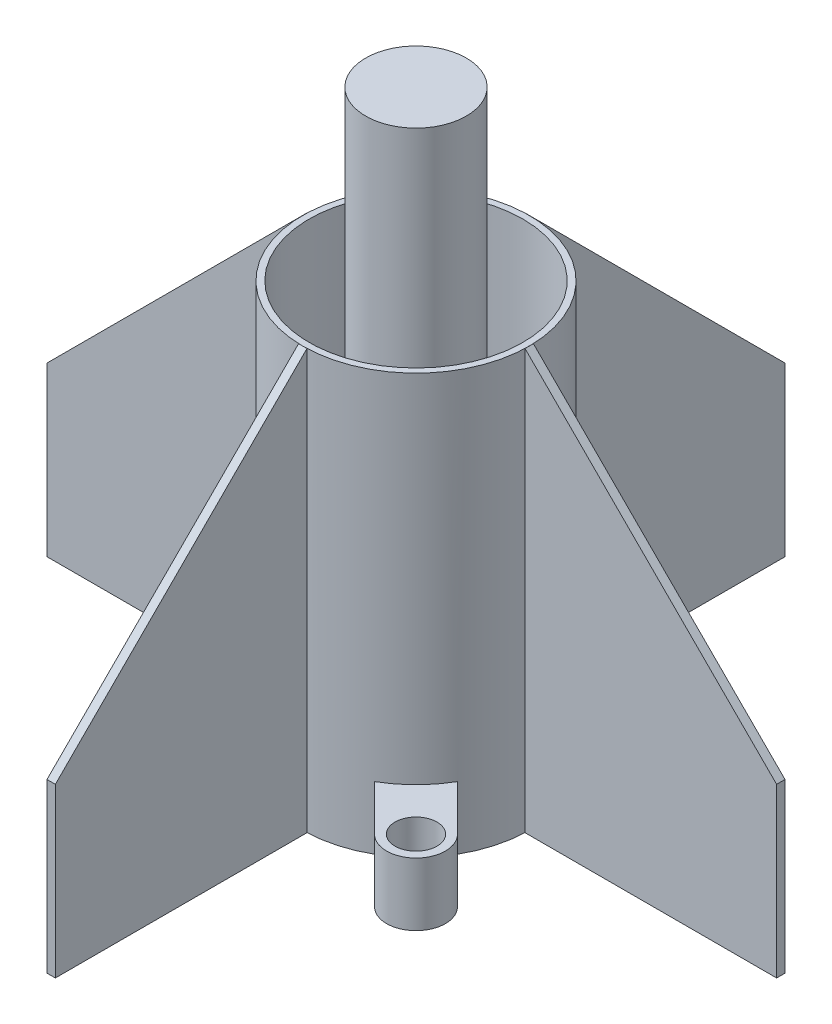
ISO-10303-21;
HEADER;
FILE_DESCRIPTION(('STEP AP214'),'2;1');
FILE_NAME('part.step','',(''),(''),'','','');
FILE_SCHEMA(('AUTOMOTIVE_DESIGN { 1 0 10303 214 1 1 1 1 }'));
ENDSEC;
DATA;
#1=APPLICATION_CONTEXT('core data for automotive mechanical design processes');
#2=APPLICATION_PROTOCOL_DEFINITION('international standard','automotive_design',2000,#1);
#3=PRODUCT_CONTEXT('',#1,'mechanical');
#4=PRODUCT('Part','Part','',(#3));
#5=PRODUCT_RELATED_PRODUCT_CATEGORY('part','',(#4));
#6=PRODUCT_DEFINITION_FORMATION('','',#4);
#7=PRODUCT_DEFINITION_CONTEXT('part definition',#1,'design');
#8=PRODUCT_DEFINITION('design','',#6,#7);
#9=PRODUCT_DEFINITION_SHAPE('','',#8);
#10=(LENGTH_UNIT() NAMED_UNIT(*) SI_UNIT(.MILLI.,.METRE.));
#11=(NAMED_UNIT(*) PLANE_ANGLE_UNIT() SI_UNIT($,.RADIAN.));
#12=(NAMED_UNIT(*) SI_UNIT($,.STERADIAN.) SOLID_ANGLE_UNIT());
#13=UNCERTAINTY_MEASURE_WITH_UNIT(LENGTH_MEASURE(1.E-05),#10,'distance_accuracy_value','');
#14=(GEOMETRIC_REPRESENTATION_CONTEXT(3) GLOBAL_UNCERTAINTY_ASSIGNED_CONTEXT((#13)) GLOBAL_UNIT_ASSIGNED_CONTEXT((#10,
#11,#12)) REPRESENTATION_CONTEXT('',''));
#15=CARTESIAN_POINT('',(0.,0.,0.));
#16=DIRECTION('',(0.,0.,1.));
#17=DIRECTION('',(1.,0.,0.));
#18=AXIS2_PLACEMENT_3D('',#15,#16,#17);
#19=CARTESIAN_POINT('',(1.,0.,-87.));
#20=DIRECTION('',(0.,1.,0.));
#21=DIRECTION('',(0.,0.,1.));
#22=AXIS2_PLACEMENT_3D('',#19,#20,#21);
#23=PLANE('',#22);
#24=DIRECTION('',(0.,0.,-1.));
#25=VECTOR('',#24,1.);
#26=CARTESIAN_POINT('',(-1.,0.,-87.));
#27=LINE('',#26,#25);
#28=CARTESIAN_POINT('',(-1.,0.,-27.));
#29=VERTEX_POINT('',#28);
#30=CARTESIAN_POINT('',(-1.,0.,-87.));
#31=VERTEX_POINT('',#30);
#32=EDGE_CURVE('E108',#29,#31,#27,.T.);
#33=ORIENTED_EDGE('',*,*,#32,.T.);
#34=DIRECTION('',(-1.,0.,0.));
#35=VECTOR('',#34,1.);
#36=CARTESIAN_POINT('',(1.,0.,-87.));
#37=LINE('',#36,#35);
#38=CARTESIAN_POINT('',(1.,0.,-87.));
#39=VERTEX_POINT('',#38);
#40=EDGE_CURVE('E12',#39,#31,#37,.T.);
#41=ORIENTED_EDGE('',*,*,#40,.F.);
#42=DIRECTION('',(0.,0.,-1.));
#43=VECTOR('',#42,1.);
#44=CARTESIAN_POINT('',(1.,0.,-87.));
#45=LINE('',#44,#43);
#46=CARTESIAN_POINT('',(1.,0.,-27.));
#47=VERTEX_POINT('',#46);
#48=EDGE_CURVE('E96',#47,#39,#45,.T.);
#49=ORIENTED_EDGE('',*,*,#48,.F.);
#50=DIRECTION('',(-1.,0.,0.));
#51=VECTOR('',#50,1.);
#52=CARTESIAN_POINT('',(1.,0.,-27.));
#53=LINE('',#52,#51);
#54=EDGE_CURVE('E104',#47,#29,#53,.T.);
#55=ORIENTED_EDGE('',*,*,#54,.T.);
#56=EDGE_LOOP('',(#33,#41,#49,#55));
#57=FACE_BOUND('',#56,.T.);
#58=ADVANCED_FACE('F45',(#57),#23,.F.);
#59=CARTESIAN_POINT('',(1.,40.,-87.));
#60=DIRECTION('',(0.,0.,1.));
#61=DIRECTION('',(1.,0.,0.));
#62=AXIS2_PLACEMENT_3D('',#59,#60,#61);
#63=PLANE('',#62);
#64=DIRECTION('',(0.,1.,0.));
#65=VECTOR('',#64,1.);
#66=CARTESIAN_POINT('',(-1.,40.,-87.));
#67=LINE('',#66,#65);
#68=CARTESIAN_POINT('',(-1.,40.,-87.));
#69=VERTEX_POINT('',#68);
#70=EDGE_CURVE('E100',#31,#69,#67,.T.);
#71=ORIENTED_EDGE('',*,*,#70,.T.);
#72=DIRECTION('',(-1.,0.,0.));
#73=VECTOR('',#72,1.);
#74=CARTESIAN_POINT('',(1.,40.,-87.));
#75=LINE('',#74,#73);
#76=CARTESIAN_POINT('',(1.,40.,-87.));
#77=VERTEX_POINT('',#76);
#78=EDGE_CURVE('E53',#77,#69,#75,.T.);
#79=ORIENTED_EDGE('',*,*,#78,.F.);
#80=DIRECTION('',(0.,1.,0.));
#81=VECTOR('',#80,1.);
#82=CARTESIAN_POINT('',(1.,40.,-87.));
#83=LINE('',#82,#81);
#84=EDGE_CURVE('E91',#39,#77,#83,.T.);
#85=ORIENTED_EDGE('',*,*,#84,.F.);
#86=ORIENTED_EDGE('',*,*,#40,.T.);
#87=EDGE_LOOP('',(#71,#79,#85,#86));
#88=FACE_BOUND('',#87,.T.);
#89=ADVANCED_FACE('F99',(#88),#63,.F.);
#90=CARTESIAN_POINT('',(1.,100.,-27.));
#91=DIRECTION('',(0.,-0.707106781186547,0.707106781186547));
#92=DIRECTION('',(0.,-0.707106781186548,-0.707106781186548));
#93=AXIS2_PLACEMENT_3D('',#90,#91,#92);
#94=PLANE('',#93);
#95=DIRECTION('',(0.,0.707106781186547,0.707106781186547));
#96=VECTOR('',#95,1.);
#97=CARTESIAN_POINT('',(-1.,100.,-27.));
#98=LINE('',#97,#96);
#99=CARTESIAN_POINT('',(-1.,100.,-27.));
#100=VERTEX_POINT('',#99);
#101=EDGE_CURVE('E78',#69,#100,#98,.T.);
#102=ORIENTED_EDGE('',*,*,#101,.T.);
#103=DIRECTION('',(-1.,0.,0.));
#104=VECTOR('',#103,1.);
#105=CARTESIAN_POINT('',(1.,100.,-27.));
#106=LINE('',#105,#104);
#107=CARTESIAN_POINT('',(1.,100.,-27.));
#108=VERTEX_POINT('',#107);
#109=EDGE_CURVE('E101',#108,#100,#106,.T.);
#110=ORIENTED_EDGE('',*,*,#109,.F.);
#111=DIRECTION('',(0.,0.707106781186547,0.707106781186547));
#112=VECTOR('',#111,1.);
#113=CARTESIAN_POINT('',(1.,100.,-27.));
#114=LINE('',#113,#112);
#115=EDGE_CURVE('E94',#77,#108,#114,.T.);
#116=ORIENTED_EDGE('',*,*,#115,.F.);
#117=ORIENTED_EDGE('',*,*,#78,.T.);
#118=EDGE_LOOP('',(#102,#110,#116,#117));
#119=FACE_BOUND('',#118,.T.);
#120=ADVANCED_FACE('F102',(#119),#94,.F.);
#121=CARTESIAN_POINT('',(1.,0.,-27.));
#122=DIRECTION('',(0.,0.,-1.));
#123=DIRECTION('',(-1.,0.,0.));
#124=AXIS2_PLACEMENT_3D('',#121,#122,#123);
#125=PLANE('',#124);
#126=DIRECTION('',(0.,-1.,0.));
#127=VECTOR('',#126,1.);
#128=CARTESIAN_POINT('',(-1.,0.,-27.));
#129=LINE('',#128,#127);
#130=EDGE_CURVE('E84',#100,#29,#129,.T.);
#131=ORIENTED_EDGE('',*,*,#130,.T.);
#132=ORIENTED_EDGE('',*,*,#54,.F.);
#133=DIRECTION('',(0.,-1.,0.));
#134=VECTOR('',#133,1.);
#135=CARTESIAN_POINT('',(1.,0.,-27.));
#136=LINE('',#135,#134);
#137=EDGE_CURVE('E61',#108,#47,#136,.T.);
#138=ORIENTED_EDGE('',*,*,#137,.F.);
#139=ORIENTED_EDGE('',*,*,#109,.T.);
#140=EDGE_LOOP('',(#131,#132,#138,#139));
#141=FACE_BOUND('',#140,.T.);
#142=ADVANCED_FACE('F115',(#141),#125,.F.);
#143=CARTESIAN_POINT('',(1.,0.,0.));
#144=DIRECTION('',(-1.,0.,0.));
#145=DIRECTION('',(0.,0.,1.));
#146=AXIS2_PLACEMENT_3D('',#143,#144,#145);
#147=PLANE('',#146);
#148=ORIENTED_EDGE('',*,*,#48,.T.);
#149=ORIENTED_EDGE('',*,*,#84,.T.);
#150=ORIENTED_EDGE('',*,*,#115,.T.);
#151=ORIENTED_EDGE('',*,*,#137,.T.);
#152=EDGE_LOOP('',(#148,#149,#150,#151));
#153=FACE_BOUND('',#152,.T.);
#154=ADVANCED_FACE('F92',(#153),#147,.F.);
#155=CARTESIAN_POINT('',(-1.,0.,0.));
#156=DIRECTION('',(-1.,0.,0.));
#157=DIRECTION('',(0.,0.,1.));
#158=AXIS2_PLACEMENT_3D('',#155,#156,#157);
#159=PLANE('',#158);
#160=ORIENTED_EDGE('',*,*,#32,.F.);
#161=ORIENTED_EDGE('',*,*,#130,.F.);
#162=ORIENTED_EDGE('',*,*,#101,.F.);
#163=ORIENTED_EDGE('',*,*,#70,.F.);
#164=EDGE_LOOP('',(#160,#161,#162,#163));
#165=FACE_BOUND('',#164,.T.);
#166=ADVANCED_FACE('F118',(#165),#159,.T.);
#167=CLOSED_SHELL('',(#58,#89,#120,#142,#154,#166));
#168=MANIFOLD_SOLID_BREP('B2',#167);
#169=CARTESIAN_POINT('',(1.,0.,27.));
#170=DIRECTION('',(0.,0.,1.));
#171=DIRECTION('',(1.,0.,0.));
#172=AXIS2_PLACEMENT_3D('',#169,#170,#171);
#173=PLANE('',#172);
#174=DIRECTION('',(0.,1.,0.));
#175=VECTOR('',#174,1.);
#176=CARTESIAN_POINT('',(-1.,0.,27.));
#177=LINE('',#176,#175);
#178=CARTESIAN_POINT('',(-1.,0.,27.));
#179=VERTEX_POINT('',#178);
#180=CARTESIAN_POINT('',(-1.,100.,27.));
#181=VERTEX_POINT('',#180);
#182=EDGE_CURVE('E241',#179,#181,#177,.T.);
#183=ORIENTED_EDGE('',*,*,#182,.T.);
#184=DIRECTION('',(-1.,0.,0.));
#185=VECTOR('',#184,1.);
#186=CARTESIAN_POINT('',(1.,100.,27.));
#187=LINE('',#186,#185);
#188=CARTESIAN_POINT('',(1.,100.,27.));
#189=VERTEX_POINT('',#188);
#190=EDGE_CURVE('E43',#189,#181,#187,.T.);
#191=ORIENTED_EDGE('',*,*,#190,.F.);
#192=DIRECTION('',(0.,1.,0.));
#193=VECTOR('',#192,1.);
#194=CARTESIAN_POINT('',(1.,0.,27.));
#195=LINE('',#194,#193);
#196=CARTESIAN_POINT('',(1.,0.,27.));
#197=VERTEX_POINT('',#196);
#198=EDGE_CURVE('E229',#197,#189,#195,.T.);
#199=ORIENTED_EDGE('',*,*,#198,.F.);
#200=DIRECTION('',(-1.,0.,0.));
#201=VECTOR('',#200,1.);
#202=CARTESIAN_POINT('',(1.,0.,27.));
#203=LINE('',#202,#201);
#204=EDGE_CURVE('E237',#197,#179,#203,.T.);
#205=ORIENTED_EDGE('',*,*,#204,.T.);
#206=EDGE_LOOP('',(#183,#191,#199,#205));
#207=FACE_BOUND('',#206,.T.);
#208=ADVANCED_FACE('F178',(#207),#173,.F.);
#209=CARTESIAN_POINT('',(1.,100.,27.));
#210=DIRECTION('',(0.,-0.707106781186547,-0.707106781186547));
#211=DIRECTION('',(0.,0.707106781186548,-0.707106781186548));
#212=AXIS2_PLACEMENT_3D('',#209,#210,#211);
#213=PLANE('',#212);
#214=DIRECTION('',(0.,-0.707106781186547,0.707106781186547));
#215=VECTOR('',#214,1.);
#216=CARTESIAN_POINT('',(-1.,100.,27.));
#217=LINE('',#216,#215);
#218=CARTESIAN_POINT('',(-1.,40.,87.));
#219=VERTEX_POINT('',#218);
#220=EDGE_CURVE('E233',#181,#219,#217,.T.);
#221=ORIENTED_EDGE('',*,*,#220,.T.);
#222=DIRECTION('',(-1.,0.,0.));
#223=VECTOR('',#222,1.);
#224=CARTESIAN_POINT('',(1.,40.,87.));
#225=LINE('',#224,#223);
#226=CARTESIAN_POINT('',(1.,40.,87.));
#227=VERTEX_POINT('',#226);
#228=EDGE_CURVE('E186',#227,#219,#225,.T.);
#229=ORIENTED_EDGE('',*,*,#228,.F.);
#230=DIRECTION('',(0.,-0.707106781186547,0.707106781186547));
#231=VECTOR('',#230,1.);
#232=CARTESIAN_POINT('',(1.,100.,27.));
#233=LINE('',#232,#231);
#234=EDGE_CURVE('E224',#189,#227,#233,.T.);
#235=ORIENTED_EDGE('',*,*,#234,.F.);
#236=ORIENTED_EDGE('',*,*,#190,.T.);
#237=EDGE_LOOP('',(#221,#229,#235,#236));
#238=FACE_BOUND('',#237,.T.);
#239=ADVANCED_FACE('F232',(#238),#213,.F.);
#240=CARTESIAN_POINT('',(1.,40.,87.));
#241=DIRECTION('',(0.,0.,-1.));
#242=DIRECTION('',(-1.,0.,0.));
#243=AXIS2_PLACEMENT_3D('',#240,#241,#242);
#244=PLANE('',#243);
#245=DIRECTION('',(0.,-1.,0.));
#246=VECTOR('',#245,1.);
#247=CARTESIAN_POINT('',(-1.,40.,87.));
#248=LINE('',#247,#246);
#249=CARTESIAN_POINT('',(-1.,0.,87.));
#250=VERTEX_POINT('',#249);
#251=EDGE_CURVE('E211',#219,#250,#248,.T.);
#252=ORIENTED_EDGE('',*,*,#251,.T.);
#253=DIRECTION('',(-1.,0.,0.));
#254=VECTOR('',#253,1.);
#255=CARTESIAN_POINT('',(1.,0.,87.));
#256=LINE('',#255,#254);
#257=CARTESIAN_POINT('',(1.,0.,87.));
#258=VERTEX_POINT('',#257);
#259=EDGE_CURVE('E234',#258,#250,#256,.T.);
#260=ORIENTED_EDGE('',*,*,#259,.F.);
#261=DIRECTION('',(0.,-1.,0.));
#262=VECTOR('',#261,1.);
#263=CARTESIAN_POINT('',(1.,40.,87.));
#264=LINE('',#263,#262);
#265=EDGE_CURVE('E227',#227,#258,#264,.T.);
#266=ORIENTED_EDGE('',*,*,#265,.F.);
#267=ORIENTED_EDGE('',*,*,#228,.T.);
#268=EDGE_LOOP('',(#252,#260,#266,#267));
#269=FACE_BOUND('',#268,.T.);
#270=ADVANCED_FACE('F235',(#269),#244,.F.);
#271=CARTESIAN_POINT('',(1.,0.,87.));
#272=DIRECTION('',(0.,1.,0.));
#273=DIRECTION('',(0.,0.,1.));
#274=AXIS2_PLACEMENT_3D('',#271,#272,#273);
#275=PLANE('',#274);
#276=DIRECTION('',(0.,0.,-1.));
#277=VECTOR('',#276,1.);
#278=CARTESIAN_POINT('',(-1.,0.,87.));
#279=LINE('',#278,#277);
#280=EDGE_CURVE('E217',#250,#179,#279,.T.);
#281=ORIENTED_EDGE('',*,*,#280,.T.);
#282=ORIENTED_EDGE('',*,*,#204,.F.);
#283=DIRECTION('',(0.,0.,-1.));
#284=VECTOR('',#283,1.);
#285=CARTESIAN_POINT('',(1.,0.,87.));
#286=LINE('',#285,#284);
#287=EDGE_CURVE('E194',#258,#197,#286,.T.);
#288=ORIENTED_EDGE('',*,*,#287,.F.);
#289=ORIENTED_EDGE('',*,*,#259,.T.);
#290=EDGE_LOOP('',(#281,#282,#288,#289));
#291=FACE_BOUND('',#290,.T.);
#292=ADVANCED_FACE('F248',(#291),#275,.F.);
#293=CARTESIAN_POINT('',(1.,0.,0.));
#294=DIRECTION('',(-1.,0.,0.));
#295=DIRECTION('',(0.,0.,1.));
#296=AXIS2_PLACEMENT_3D('',#293,#294,#295);
#297=PLANE('',#296);
#298=ORIENTED_EDGE('',*,*,#198,.T.);
#299=ORIENTED_EDGE('',*,*,#234,.T.);
#300=ORIENTED_EDGE('',*,*,#265,.T.);
#301=ORIENTED_EDGE('',*,*,#287,.T.);
#302=EDGE_LOOP('',(#298,#299,#300,#301));
#303=FACE_BOUND('',#302,.T.);
#304=ADVANCED_FACE('F225',(#303),#297,.F.);
#305=CARTESIAN_POINT('',(-1.,0.,0.));
#306=DIRECTION('',(-1.,0.,0.));
#307=DIRECTION('',(0.,0.,1.));
#308=AXIS2_PLACEMENT_3D('',#305,#306,#307);
#309=PLANE('',#308);
#310=ORIENTED_EDGE('',*,*,#182,.F.);
#311=ORIENTED_EDGE('',*,*,#280,.F.);
#312=ORIENTED_EDGE('',*,*,#251,.F.);
#313=ORIENTED_EDGE('',*,*,#220,.F.);
#314=EDGE_LOOP('',(#310,#311,#312,#313));
#315=FACE_BOUND('',#314,.T.);
#316=ADVANCED_FACE('F251',(#315),#309,.T.);
#317=CLOSED_SHELL('',(#208,#239,#270,#292,#304,#316));
#318=MANIFOLD_SOLID_BREP('B6',#317);
#319=CARTESIAN_POINT('',(-87.,40.,1.));
#320=DIRECTION('',(1.,0.,0.));
#321=DIRECTION('',(0.,0.,-1.));
#322=AXIS2_PLACEMENT_3D('',#319,#320,#321);
#323=PLANE('',#322);
#324=DIRECTION('',(0.,-1.,0.));
#325=VECTOR('',#324,1.);
#326=CARTESIAN_POINT('',(-87.,40.,-1.));
#327=LINE('',#326,#325);
#328=CARTESIAN_POINT('',(-87.,40.,-1.));
#329=VERTEX_POINT('',#328);
#330=CARTESIAN_POINT('',(-87.,0.,-1.));
#331=VERTEX_POINT('',#330);
#332=EDGE_CURVE('E374',#329,#331,#327,.T.);
#333=ORIENTED_EDGE('',*,*,#332,.T.);
#334=DIRECTION('',(0.,0.,-1.));
#335=VECTOR('',#334,1.);
#336=CARTESIAN_POINT('',(-87.,0.,1.));
#337=LINE('',#336,#335);
#338=CARTESIAN_POINT('',(-87.,0.,1.));
#339=VERTEX_POINT('',#338);
#340=EDGE_CURVE('E176',#339,#331,#337,.T.);
#341=ORIENTED_EDGE('',*,*,#340,.F.);
#342=DIRECTION('',(0.,-1.,0.));
#343=VECTOR('',#342,1.);
#344=CARTESIAN_POINT('',(-87.,40.,1.));
#345=LINE('',#344,#343);
#346=CARTESIAN_POINT('',(-87.,40.,1.));
#347=VERTEX_POINT('',#346);
#348=EDGE_CURVE('E362',#347,#339,#345,.T.);
#349=ORIENTED_EDGE('',*,*,#348,.F.);
#350=DIRECTION('',(0.,0.,-1.));
#351=VECTOR('',#350,1.);
#352=CARTESIAN_POINT('',(-87.,40.,1.));
#353=LINE('',#352,#351);
#354=EDGE_CURVE('E370',#347,#329,#353,.T.);
#355=ORIENTED_EDGE('',*,*,#354,.T.);
#356=EDGE_LOOP('',(#333,#341,#349,#355));
#357=FACE_BOUND('',#356,.T.);
#358=ADVANCED_FACE('F311',(#357),#323,.F.);
#359=CARTESIAN_POINT('',(-87.,0.,1.));
#360=DIRECTION('',(0.,1.,0.));
#361=DIRECTION('',(-1.,0.,0.));
#362=AXIS2_PLACEMENT_3D('',#359,#360,#361);
#363=PLANE('',#362);
#364=DIRECTION('',(1.,0.,0.));
#365=VECTOR('',#364,1.);
#366=CARTESIAN_POINT('',(-87.,0.,-1.));
#367=LINE('',#366,#365);
#368=CARTESIAN_POINT('',(-27.,0.,-1.));
#369=VERTEX_POINT('',#368);
#370=EDGE_CURVE('E366',#331,#369,#367,.T.);
#371=ORIENTED_EDGE('',*,*,#370,.T.);
#372=DIRECTION('',(0.,0.,-1.));
#373=VECTOR('',#372,1.);
#374=CARTESIAN_POINT('',(-27.,0.,1.));
#375=LINE('',#374,#373);
#376=CARTESIAN_POINT('',(-27.,0.,1.));
#377=VERTEX_POINT('',#376);
#378=EDGE_CURVE('E319',#377,#369,#375,.T.);
#379=ORIENTED_EDGE('',*,*,#378,.F.);
#380=DIRECTION('',(1.,0.,0.));
#381=VECTOR('',#380,1.);
#382=CARTESIAN_POINT('',(-87.,0.,1.));
#383=LINE('',#382,#381);
#384=EDGE_CURVE('E357',#339,#377,#383,.T.);
#385=ORIENTED_EDGE('',*,*,#384,.F.);
#386=ORIENTED_EDGE('',*,*,#340,.T.);
#387=EDGE_LOOP('',(#371,#379,#385,#386));
#388=FACE_BOUND('',#387,.T.);
#389=ADVANCED_FACE('F365',(#388),#363,.F.);
#390=CARTESIAN_POINT('',(-27.,0.,1.));
#391=DIRECTION('',(-1.,0.,0.));
#392=DIRECTION('',(0.,0.,1.));
#393=AXIS2_PLACEMENT_3D('',#390,#391,#392);
#394=PLANE('',#393);
#395=DIRECTION('',(0.,1.,0.));
#396=VECTOR('',#395,1.);
#397=CARTESIAN_POINT('',(-27.,0.,-1.));
#398=LINE('',#397,#396);
#399=CARTESIAN_POINT('',(-27.,100.,-1.));
#400=VERTEX_POINT('',#399);
#401=EDGE_CURVE('E344',#369,#400,#398,.T.);
#402=ORIENTED_EDGE('',*,*,#401,.T.);
#403=DIRECTION('',(0.,0.,-1.));
#404=VECTOR('',#403,1.);
#405=CARTESIAN_POINT('',(-27.,100.,1.));
#406=LINE('',#405,#404);
#407=CARTESIAN_POINT('',(-27.,100.,1.));
#408=VERTEX_POINT('',#407);
#409=EDGE_CURVE('E367',#408,#400,#406,.T.);
#410=ORIENTED_EDGE('',*,*,#409,.F.);
#411=DIRECTION('',(0.,1.,0.));
#412=VECTOR('',#411,1.);
#413=CARTESIAN_POINT('',(-27.,0.,1.));
#414=LINE('',#413,#412);
#415=EDGE_CURVE('E360',#377,#408,#414,.T.);
#416=ORIENTED_EDGE('',*,*,#415,.F.);
#417=ORIENTED_EDGE('',*,*,#378,.T.);
#418=EDGE_LOOP('',(#402,#410,#416,#417));
#419=FACE_BOUND('',#418,.T.);
#420=ADVANCED_FACE('F368',(#419),#394,.F.);
#421=CARTESIAN_POINT('',(-27.,100.,1.));
#422=DIRECTION('',(0.707106781186547,-0.707106781186547,0.));
#423=DIRECTION('',(0.707106781186548,0.707106781186548,0.));
#424=AXIS2_PLACEMENT_3D('',#421,#422,#423);
#425=PLANE('',#424);
#426=DIRECTION('',(-0.707106781186547,-0.707106781186547,0.));
#427=VECTOR('',#426,1.);
#428=CARTESIAN_POINT('',(-27.,100.,-1.));
#429=LINE('',#428,#427);
#430=EDGE_CURVE('E350',#400,#329,#429,.T.);
#431=ORIENTED_EDGE('',*,*,#430,.T.);
#432=ORIENTED_EDGE('',*,*,#354,.F.);
#433=DIRECTION('',(-0.707106781186547,-0.707106781186547,0.));
#434=VECTOR('',#433,1.);
#435=CARTESIAN_POINT('',(-27.,100.,1.));
#436=LINE('',#435,#434);
#437=EDGE_CURVE('E327',#408,#347,#436,.T.);
#438=ORIENTED_EDGE('',*,*,#437,.F.);
#439=ORIENTED_EDGE('',*,*,#409,.T.);
#440=EDGE_LOOP('',(#431,#432,#438,#439));
#441=FACE_BOUND('',#440,.T.);
#442=ADVANCED_FACE('F381',(#441),#425,.F.);
#443=CARTESIAN_POINT('',(0.,0.,1.));
#444=DIRECTION('',(0.,0.,1.));
#445=DIRECTION('',(1.,0.,0.));
#446=AXIS2_PLACEMENT_3D('',#443,#444,#445);
#447=PLANE('',#446);
#448=ORIENTED_EDGE('',*,*,#348,.T.);
#449=ORIENTED_EDGE('',*,*,#384,.T.);
#450=ORIENTED_EDGE('',*,*,#415,.T.);
#451=ORIENTED_EDGE('',*,*,#437,.T.);
#452=EDGE_LOOP('',(#448,#449,#450,#451));
#453=FACE_BOUND('',#452,.T.);
#454=ADVANCED_FACE('F358',(#453),#447,.T.);
#455=CARTESIAN_POINT('',(0.,0.,-1.));
#456=DIRECTION('',(0.,0.,1.));
#457=DIRECTION('',(1.,0.,0.));
#458=AXIS2_PLACEMENT_3D('',#455,#456,#457);
#459=PLANE('',#458);
#460=ORIENTED_EDGE('',*,*,#332,.F.);
#461=ORIENTED_EDGE('',*,*,#430,.F.);
#462=ORIENTED_EDGE('',*,*,#401,.F.);
#463=ORIENTED_EDGE('',*,*,#370,.F.);
#464=EDGE_LOOP('',(#460,#461,#462,#463));
#465=FACE_BOUND('',#464,.T.);
#466=ADVANCED_FACE('F384',(#465),#459,.F.);
#467=CLOSED_SHELL('',(#358,#389,#420,#442,#454,#466));
#468=MANIFOLD_SOLID_BREP('B37',#467);
#469=CARTESIAN_POINT('',(27.,0.,1.));
#470=DIRECTION('',(1.,0.,0.));
#471=DIRECTION('',(0.,0.,-1.));
#472=AXIS2_PLACEMENT_3D('',#469,#470,#471);
#473=PLANE('',#472);
#474=DIRECTION('',(0.,-1.,0.));
#475=VECTOR('',#474,1.);
#476=CARTESIAN_POINT('',(27.,0.,-1.));
#477=LINE('',#476,#475);
#478=CARTESIAN_POINT('',(27.,100.,-1.));
#479=VERTEX_POINT('',#478);
#480=CARTESIAN_POINT('',(27.,0.,-1.));
#481=VERTEX_POINT('',#480);
#482=EDGE_CURVE('E506',#479,#481,#477,.T.);
#483=ORIENTED_EDGE('',*,*,#482,.T.);
#484=DIRECTION('',(0.,0.,-1.));
#485=VECTOR('',#484,1.);
#486=CARTESIAN_POINT('',(27.,0.,1.));
#487=LINE('',#486,#485);
#488=CARTESIAN_POINT('',(27.,0.,1.));
#489=VERTEX_POINT('',#488);
#490=EDGE_CURVE('E309',#489,#481,#487,.T.);
#491=ORIENTED_EDGE('',*,*,#490,.F.);
#492=DIRECTION('',(0.,-1.,0.));
#493=VECTOR('',#492,1.);
#494=CARTESIAN_POINT('',(27.,0.,1.));
#495=LINE('',#494,#493);
#496=CARTESIAN_POINT('',(27.,100.,1.));
#497=VERTEX_POINT('',#496);
#498=EDGE_CURVE('E494',#497,#489,#495,.T.);
#499=ORIENTED_EDGE('',*,*,#498,.F.);
#500=DIRECTION('',(0.,0.,-1.));
#501=VECTOR('',#500,1.);
#502=CARTESIAN_POINT('',(27.,100.,1.));
#503=LINE('',#502,#501);
#504=EDGE_CURVE('E502',#497,#479,#503,.T.);
#505=ORIENTED_EDGE('',*,*,#504,.T.);
#506=EDGE_LOOP('',(#483,#491,#499,#505));
#507=FACE_BOUND('',#506,.T.);
#508=ADVANCED_FACE('F443',(#507),#473,.F.);
#509=CARTESIAN_POINT('',(87.,0.,1.));
#510=DIRECTION('',(0.,1.,0.));
#511=DIRECTION('',(-1.,0.,0.));
#512=AXIS2_PLACEMENT_3D('',#509,#510,#511);
#513=PLANE('',#512);
#514=DIRECTION('',(1.,0.,0.));
#515=VECTOR('',#514,1.);
#516=CARTESIAN_POINT('',(87.,0.,-1.));
#517=LINE('',#516,#515);
#518=CARTESIAN_POINT('',(87.,0.,-1.));
#519=VERTEX_POINT('',#518);
#520=EDGE_CURVE('E498',#481,#519,#517,.T.);
#521=ORIENTED_EDGE('',*,*,#520,.T.);
#522=DIRECTION('',(0.,0.,-1.));
#523=VECTOR('',#522,1.);
#524=CARTESIAN_POINT('',(87.,0.,1.));
#525=LINE('',#524,#523);
#526=CARTESIAN_POINT('',(87.,0.,1.));
#527=VERTEX_POINT('',#526);
#528=EDGE_CURVE('E451',#527,#519,#525,.T.);
#529=ORIENTED_EDGE('',*,*,#528,.F.);
#530=DIRECTION('',(1.,0.,0.));
#531=VECTOR('',#530,1.);
#532=CARTESIAN_POINT('',(87.,0.,1.));
#533=LINE('',#532,#531);
#534=EDGE_CURVE('E489',#489,#527,#533,.T.);
#535=ORIENTED_EDGE('',*,*,#534,.F.);
#536=ORIENTED_EDGE('',*,*,#490,.T.);
#537=EDGE_LOOP('',(#521,#529,#535,#536));
#538=FACE_BOUND('',#537,.T.);
#539=ADVANCED_FACE('F497',(#538),#513,.F.);
#540=CARTESIAN_POINT('',(87.,40.,1.));
#541=DIRECTION('',(-1.,0.,0.));
#542=DIRECTION('',(0.,0.,1.));
#543=AXIS2_PLACEMENT_3D('',#540,#541,#542);
#544=PLANE('',#543);
#545=DIRECTION('',(0.,1.,0.));
#546=VECTOR('',#545,1.);
#547=CARTESIAN_POINT('',(87.,40.,-1.));
#548=LINE('',#547,#546);
#549=CARTESIAN_POINT('',(87.,40.,-1.));
#550=VERTEX_POINT('',#549);
#551=EDGE_CURVE('E476',#519,#550,#548,.T.);
#552=ORIENTED_EDGE('',*,*,#551,.T.);
#553=DIRECTION('',(0.,0.,-1.));
#554=VECTOR('',#553,1.);
#555=CARTESIAN_POINT('',(87.,40.,1.));
#556=LINE('',#555,#554);
#557=CARTESIAN_POINT('',(87.,40.,1.));
#558=VERTEX_POINT('',#557);
#559=EDGE_CURVE('E499',#558,#550,#556,.T.);
#560=ORIENTED_EDGE('',*,*,#559,.F.);
#561=DIRECTION('',(0.,1.,0.));
#562=VECTOR('',#561,1.);
#563=CARTESIAN_POINT('',(87.,40.,1.));
#564=LINE('',#563,#562);
#565=EDGE_CURVE('E492',#527,#558,#564,.T.);
#566=ORIENTED_EDGE('',*,*,#565,.F.);
#567=ORIENTED_EDGE('',*,*,#528,.T.);
#568=EDGE_LOOP('',(#552,#560,#566,#567));
#569=FACE_BOUND('',#568,.T.);
#570=ADVANCED_FACE('F500',(#569),#544,.F.);
#571=CARTESIAN_POINT('',(27.,100.,1.));
#572=DIRECTION('',(-0.707106781186547,-0.707106781186547,0.));
#573=DIRECTION('',(0.707106781186548,-0.707106781186548,0.));
#574=AXIS2_PLACEMENT_3D('',#571,#572,#573);
#575=PLANE('',#574);
#576=DIRECTION('',(-0.707106781186547,0.707106781186547,0.));
#577=VECTOR('',#576,1.);
#578=CARTESIAN_POINT('',(27.,100.,-1.));
#579=LINE('',#578,#577);
#580=EDGE_CURVE('E482',#550,#479,#579,.T.);
#581=ORIENTED_EDGE('',*,*,#580,.T.);
#582=ORIENTED_EDGE('',*,*,#504,.F.);
#583=DIRECTION('',(-0.707106781186547,0.707106781186547,0.));
#584=VECTOR('',#583,1.);
#585=CARTESIAN_POINT('',(27.,100.,1.));
#586=LINE('',#585,#584);
#587=EDGE_CURVE('E459',#558,#497,#586,.T.);
#588=ORIENTED_EDGE('',*,*,#587,.F.);
#589=ORIENTED_EDGE('',*,*,#559,.T.);
#590=EDGE_LOOP('',(#581,#582,#588,#589));
#591=FACE_BOUND('',#590,.T.);
#592=ADVANCED_FACE('F513',(#591),#575,.F.);
#593=CARTESIAN_POINT('',(0.,0.,1.));
#594=DIRECTION('',(0.,0.,1.));
#595=DIRECTION('',(1.,0.,0.));
#596=AXIS2_PLACEMENT_3D('',#593,#594,#595);
#597=PLANE('',#596);
#598=ORIENTED_EDGE('',*,*,#498,.T.);
#599=ORIENTED_EDGE('',*,*,#534,.T.);
#600=ORIENTED_EDGE('',*,*,#565,.T.);
#601=ORIENTED_EDGE('',*,*,#587,.T.);
#602=EDGE_LOOP('',(#598,#599,#600,#601));
#603=FACE_BOUND('',#602,.T.);
#604=ADVANCED_FACE('F490',(#603),#597,.T.);
#605=CARTESIAN_POINT('',(0.,0.,-1.));
#606=DIRECTION('',(0.,0.,1.));
#607=DIRECTION('',(1.,0.,0.));
#608=AXIS2_PLACEMENT_3D('',#605,#606,#607);
#609=PLANE('',#608);
#610=ORIENTED_EDGE('',*,*,#482,.F.);
#611=ORIENTED_EDGE('',*,*,#580,.F.);
#612=ORIENTED_EDGE('',*,*,#551,.F.);
#613=ORIENTED_EDGE('',*,*,#520,.F.);
#614=EDGE_LOOP('',(#610,#611,#612,#613));
#615=FACE_BOUND('',#614,.T.);
#616=ADVANCED_FACE('F516',(#615),#609,.F.);
#617=CLOSED_SHELL('',(#508,#539,#570,#592,#604,#616));
#618=MANIFOLD_SOLID_BREP('B170',#617);
#619=CARTESIAN_POINT('',(0.,100.,0.));
#620=DIRECTION('',(0.,-1.,0.));
#621=DIRECTION('',(0.,0.,-1.));
#622=AXIS2_PLACEMENT_3D('',#619,#620,#621);
#623=CYLINDRICAL_SURFACE('',#622,25.5);
#624=CARTESIAN_POINT('',(0.,100.,0.));
#625=DIRECTION('',(0.,-1.,0.));
#626=DIRECTION('',(0.,0.,-1.));
#627=AXIS2_PLACEMENT_3D('',#624,#625,#626);
#628=CIRCLE('',#627,25.5);
#629=CARTESIAN_POINT('',(0.,100.,-25.5));
#630=VERTEX_POINT('',#629);
#631=EDGE_CURVE('E703',#630,#630,#628,.T.);
#632=ORIENTED_EDGE('',*,*,#631,.F.);
#633=EDGE_LOOP('',(#632));
#634=FACE_BOUND('',#633,.T.);
#635=CARTESIAN_POINT('',(0.,4.,0.));
#636=DIRECTION('',(0.,-1.,0.));
#637=DIRECTION('',(0.,0.,-1.));
#638=AXIS2_PLACEMENT_3D('',#635,#636,#637);
#639=CIRCLE('',#638,25.5);
#640=CARTESIAN_POINT('',(0.,4.,-25.5));
#641=VERTEX_POINT('',#640);
#642=EDGE_CURVE('E710',#641,#641,#639,.F.);
#643=ORIENTED_EDGE('',*,*,#642,.F.);
#644=EDGE_LOOP('',(#643));
#645=FACE_BOUND('',#644,.T.);
#646=ADVANCED_FACE('F566',(#634,#645),#623,.F.);
#647=CARTESIAN_POINT('',(0.,100.,0.));
#648=DIRECTION('',(0.,-1.,0.));
#649=DIRECTION('',(0.,0.,-1.));
#650=AXIS2_PLACEMENT_3D('',#647,#648,#649);
#651=CYLINDRICAL_SURFACE('',#650,27.);
#652=CARTESIAN_POINT('',(0.,0.,0.));
#653=DIRECTION('',(0.,1.,0.));
#654=DIRECTION('',(0.,0.,1.));
#655=AXIS2_PLACEMENT_3D('',#652,#653,#654);
#656=CIRCLE('',#655,27.);
#657=CARTESIAN_POINT('',(23.3888363828916,0.,13.48934144628));
#658=VERTEX_POINT('',#657);
#659=CARTESIAN_POINT('',(-13.4893414462799,0.,-23.3888363828916));
#660=VERTEX_POINT('',#659);
#661=EDGE_CURVE('E711',#658,#660,#656,.T.);
#662=ORIENTED_EDGE('',*,*,#661,.T.);
#663=DIRECTION('',(0.,-1.,0.));
#664=VECTOR('',#663,1.);
#665=CARTESIAN_POINT('',(-13.4893414462799,15.,-23.3888363828916));
#666=LINE('',#665,#664);
#667=CARTESIAN_POINT('',(-13.4893414462799,15.,-23.3888363828916));
#668=VERTEX_POINT('',#667);
#669=EDGE_CURVE('E581',#668,#660,#666,.T.);
#670=ORIENTED_EDGE('',*,*,#669,.F.);
#671=CARTESIAN_POINT('',(0.,15.,0.));
#672=DIRECTION('',(0.,-1.,0.));
#673=DIRECTION('',(0.,0.,-1.));
#674=AXIS2_PLACEMENT_3D('',#671,#672,#673);
#675=CIRCLE('',#674,27.);
#676=CARTESIAN_POINT('',(-23.3888363828916,15.,-13.48934144628));
#677=VERTEX_POINT('',#676);
#678=EDGE_CURVE('E441',#677,#668,#675,.T.);
#679=ORIENTED_EDGE('',*,*,#678,.F.);
#680=DIRECTION('',(0.,-1.,0.));
#681=VECTOR('',#680,1.);
#682=CARTESIAN_POINT('',(-23.3888363828916,15.,-13.48934144628));
#683=LINE('',#682,#681);
#684=CARTESIAN_POINT('',(-23.3888363828916,0.,-13.48934144628));
#685=VERTEX_POINT('',#684);
#686=EDGE_CURVE('E640',#677,#685,#683,.T.);
#687=ORIENTED_EDGE('',*,*,#686,.T.);
#688=CARTESIAN_POINT('',(13.4893414462799,0.,23.3888363828916));
#689=VERTEX_POINT('',#688);
#690=EDGE_CURVE('E706',#685,#689,#656,.T.);
#691=ORIENTED_EDGE('',*,*,#690,.T.);
#692=DIRECTION('',(0.,-1.,0.));
#693=VECTOR('',#692,1.);
#694=CARTESIAN_POINT('',(13.4893414462799,15.,23.3888363828916));
#695=LINE('',#694,#693);
#696=CARTESIAN_POINT('',(13.4893414462799,15.,23.3888363828916));
#697=VERTEX_POINT('',#696);
#698=EDGE_CURVE('E685',#697,#689,#695,.T.);
#699=ORIENTED_EDGE('',*,*,#698,.F.);
#700=CARTESIAN_POINT('',(0.,15.,0.));
#701=DIRECTION('',(0.,1.,0.));
#702=DIRECTION('',(0.,0.,1.));
#703=AXIS2_PLACEMENT_3D('',#700,#701,#702);
#704=CIRCLE('',#703,27.);
#705=CARTESIAN_POINT('',(23.3888363828916,15.,13.48934144628));
#706=VERTEX_POINT('',#705);
#707=EDGE_CURVE('E574',#697,#706,#704,.T.);
#708=ORIENTED_EDGE('',*,*,#707,.T.);
#709=DIRECTION('',(0.,-1.,0.));
#710=VECTOR('',#709,1.);
#711=CARTESIAN_POINT('',(23.3888363828916,15.,13.48934144628));
#712=LINE('',#711,#710);
#713=EDGE_CURVE('E677',#706,#658,#712,.T.);
#714=ORIENTED_EDGE('',*,*,#713,.T.);
#715=EDGE_LOOP('',(#662,#670,#679,#687,#691,#699,#708,#714));
#716=FACE_BOUND('',#715,.T.);
#717=CARTESIAN_POINT('',(0.,100.,0.));
#718=DIRECTION('',(0.,1.,0.));
#719=DIRECTION('',(0.,0.,1.));
#720=AXIS2_PLACEMENT_3D('',#717,#718,#719);
#721=CIRCLE('',#720,27.);
#722=CARTESIAN_POINT('',(0.,100.,27.));
#723=VERTEX_POINT('',#722);
#724=EDGE_CURVE('E707',#723,#723,#721,.T.);
#725=ORIENTED_EDGE('',*,*,#724,.F.);
#726=EDGE_LOOP('',(#725));
#727=FACE_BOUND('',#726,.T.);
#728=ADVANCED_FACE('F722',(#716,#727),#651,.T.);
#729=CARTESIAN_POINT('',(0.,100.,0.));
#730=DIRECTION('',(0.,1.,0.));
#731=DIRECTION('',(0.,0.,1.));
#732=AXIS2_PLACEMENT_3D('',#729,#730,#731);
#733=PLANE('',#732);
#734=ORIENTED_EDGE('',*,*,#631,.T.);
#735=EDGE_LOOP('',(#734));
#736=FACE_BOUND('',#735,.T.);
#737=ORIENTED_EDGE('',*,*,#724,.T.);
#738=EDGE_LOOP('',(#737));
#739=FACE_BOUND('',#738,.T.);
#740=ADVANCED_FACE('F759',(#736,#739),#733,.T.);
#741=CARTESIAN_POINT('',(0.,0.,0.));
#742=DIRECTION('',(0.,1.,0.));
#743=DIRECTION('',(0.,0.,1.));
#744=AXIS2_PLACEMENT_3D('',#741,#742,#743);
#745=PLANE('',#744);
#746=CARTESIAN_POINT('',(29.2831009286926,0.,29.2831009286927));
#747=DIRECTION('',(0.,-1.,0.));
#748=DIRECTION('',(0.,0.,-1.));
#749=AXIS2_PLACEMENT_3D('',#746,#747,#748);
#750=CIRCLE('',#749,5.);
#751=CARTESIAN_POINT('',(29.2831009286926,0.,24.2831009286927));
#752=VERTEX_POINT('',#751);
#753=EDGE_CURVE('E779',#752,#752,#750,.T.);
#754=ORIENTED_EDGE('',*,*,#753,.F.);
#755=EDGE_LOOP('',(#754));
#756=FACE_BOUND('',#755,.T.);
#757=CARTESIAN_POINT('',(-29.2831009286927,0.,-29.2831009286926));
#758=DIRECTION('',(0.,-1.,0.));
#759=DIRECTION('',(0.,0.,1.));
#760=AXIS2_PLACEMENT_3D('',#757,#758,#759);
#761=CIRCLE('',#760,5.);
#762=CARTESIAN_POINT('',(-29.2831009286927,0.,-24.2831009286926));
#763=VERTEX_POINT('',#762);
#764=EDGE_CURVE('E783',#763,#763,#761,.T.);
#765=ORIENTED_EDGE('',*,*,#764,.F.);
#766=EDGE_LOOP('',(#765));
#767=FACE_BOUND('',#766,.T.);
#768=CARTESIAN_POINT('',(0.,0.,0.));
#769=DIRECTION('',(0.,-1.,0.));
#770=DIRECTION('',(0.,0.,-1.));
#771=AXIS2_PLACEMENT_3D('',#768,#769,#770);
#772=CIRCLE('',#771,10.5);
#773=CARTESIAN_POINT('',(0.,0.,-10.5));
#774=VERTEX_POINT('',#773);
#775=EDGE_CURVE('E688',#774,#774,#772,.T.);
#776=ORIENTED_EDGE('',*,*,#775,.F.);
#777=EDGE_LOOP('',(#776));
#778=FACE_BOUND('',#777,.T.);
#779=ORIENTED_EDGE('',*,*,#690,.F.);
#780=DIRECTION('',(-0.707106781186546,0.,-0.707106781186549));
#781=VECTOR('',#780,1.);
#782=CARTESIAN_POINT('',(-23.3888363828916,0.,-13.48934144628));
#783=LINE('',#782,#781);
#784=CARTESIAN_POINT('',(-34.2328483969984,0.,-24.3333534603869));
#785=VERTEX_POINT('',#784);
#786=EDGE_CURVE('E659',#685,#785,#783,.T.);
#787=ORIENTED_EDGE('',*,*,#786,.T.);
#788=CARTESIAN_POINT('',(-29.2831009286926,0.,-29.2831009286927));
#789=DIRECTION('',(0.,-1.,0.));
#790=DIRECTION('',(0.,0.,-1.));
#791=AXIS2_PLACEMENT_3D('',#788,#789,#790);
#792=CIRCLE('',#791,7.);
#793=CARTESIAN_POINT('',(-24.3333534603867,0.,-34.2328483969985));
#794=VERTEX_POINT('',#793);
#795=EDGE_CURVE('E634',#785,#794,#792,.T.);
#796=ORIENTED_EDGE('',*,*,#795,.T.);
#797=DIRECTION('',(0.707106781186546,0.,0.707106781186549));
#798=VECTOR('',#797,1.);
#799=CARTESIAN_POINT('',(-13.4893414462799,0.,-23.3888363828916));
#800=LINE('',#799,#798);
#801=EDGE_CURVE('E650',#794,#660,#800,.T.);
#802=ORIENTED_EDGE('',*,*,#801,.T.);
#803=ORIENTED_EDGE('',*,*,#661,.F.);
#804=DIRECTION('',(0.707106781186546,0.,0.707106781186549));
#805=VECTOR('',#804,1.);
#806=CARTESIAN_POINT('',(23.3888363828916,0.,13.48934144628));
#807=LINE('',#806,#805);
#808=CARTESIAN_POINT('',(34.2328483969984,0.,24.3333534603869));
#809=VERTEX_POINT('',#808);
#810=EDGE_CURVE('E664',#658,#809,#807,.T.);
#811=ORIENTED_EDGE('',*,*,#810,.T.);
#812=CARTESIAN_POINT('',(29.2831009286926,0.,29.2831009286927));
#813=DIRECTION('',(0.,-1.,0.));
#814=DIRECTION('',(0.,0.,1.));
#815=AXIS2_PLACEMENT_3D('',#812,#813,#814);
#816=CIRCLE('',#815,7.);
#817=CARTESIAN_POINT('',(24.3333534603867,0.,34.2328483969985));
#818=VERTEX_POINT('',#817);
#819=EDGE_CURVE('E680',#809,#818,#816,.T.);
#820=ORIENTED_EDGE('',*,*,#819,.T.);
#821=DIRECTION('',(-0.707106781186546,0.,-0.707106781186549));
#822=VECTOR('',#821,1.);
#823=CARTESIAN_POINT('',(13.4893414462799,0.,23.3888363828916));
#824=LINE('',#823,#822);
#825=EDGE_CURVE('E671',#818,#689,#824,.T.);
#826=ORIENTED_EDGE('',*,*,#825,.T.);
#827=EDGE_LOOP('',(#779,#787,#796,#802,#803,#811,#820,#826));
#828=FACE_BOUND('',#827,.T.);
#829=ADVANCED_FACE('F737',(#756,#767,#778,#828),#745,.F.);
#830=CARTESIAN_POINT('',(0.,4.,0.));
#831=DIRECTION('',(0.,-1.,0.));
#832=DIRECTION('',(0.,0.,-1.));
#833=AXIS2_PLACEMENT_3D('',#830,#831,#832);
#834=PLANE('',#833);
#835=CARTESIAN_POINT('',(0.,4.,0.));
#836=DIRECTION('',(0.,-1.,0.));
#837=DIRECTION('',(0.,0.,-1.));
#838=AXIS2_PLACEMENT_3D('',#835,#836,#837);
#839=CIRCLE('',#838,22.);
#840=CARTESIAN_POINT('',(0.,4.,-22.));
#841=VERTEX_POINT('',#840);
#842=EDGE_CURVE('E715',#841,#841,#839,.T.);
#843=ORIENTED_EDGE('',*,*,#842,.T.);
#844=EDGE_LOOP('',(#843));
#845=FACE_BOUND('',#844,.T.);
#846=ORIENTED_EDGE('',*,*,#642,.T.);
#847=EDGE_LOOP('',(#846));
#848=FACE_BOUND('',#847,.T.);
#849=ADVANCED_FACE('F764',(#845,#848),#834,.F.);
#850=CARTESIAN_POINT('',(0.,140.,0.));
#851=DIRECTION('',(0.,-1.,0.));
#852=DIRECTION('',(0.,0.,-1.));
#853=AXIS2_PLACEMENT_3D('',#850,#851,#852);
#854=CYLINDRICAL_SURFACE('',#853,12.);
#855=CARTESIAN_POINT('',(0.,14.,0.));
#856=DIRECTION('',(0.,-1.,0.));
#857=DIRECTION('',(0.,0.,-1.));
#858=AXIS2_PLACEMENT_3D('',#855,#856,#857);
#859=CIRCLE('',#858,12.);
#860=CARTESIAN_POINT('',(0.,14.,-12.));
#861=VERTEX_POINT('',#860);
#862=EDGE_CURVE('E718',#861,#861,#859,.F.);
#863=ORIENTED_EDGE('',*,*,#862,.T.);
#864=EDGE_LOOP('',(#863));
#865=FACE_BOUND('',#864,.T.);
#866=CARTESIAN_POINT('',(0.,140.,0.));
#867=DIRECTION('',(0.,-1.,0.));
#868=DIRECTION('',(0.,0.,-1.));
#869=AXIS2_PLACEMENT_3D('',#866,#867,#868);
#870=CIRCLE('',#869,12.);
#871=CARTESIAN_POINT('',(0.,140.,-12.));
#872=VERTEX_POINT('',#871);
#873=EDGE_CURVE('E698',#872,#872,#870,.T.);
#874=ORIENTED_EDGE('',*,*,#873,.T.);
#875=EDGE_LOOP('',(#874));
#876=FACE_BOUND('',#875,.T.);
#877=ADVANCED_FACE('F774',(#865,#876),#854,.T.);
#878=CARTESIAN_POINT('',(0.,140.,0.));
#879=DIRECTION('',(0.,-1.,0.));
#880=DIRECTION('',(0.,0.,-1.));
#881=AXIS2_PLACEMENT_3D('',#878,#879,#880);
#882=PLANE('',#881);
#883=ORIENTED_EDGE('',*,*,#873,.F.);
#884=EDGE_LOOP('',(#883));
#885=FACE_BOUND('',#884,.T.);
#886=ADVANCED_FACE('F788',(#885),#882,.F.);
#887=CARTESIAN_POINT('',(0.,125.,0.));
#888=DIRECTION('',(0.,-1.,0.));
#889=DIRECTION('',(0.,0.,-1.));
#890=AXIS2_PLACEMENT_3D('',#887,#888,#889);
#891=CYLINDRICAL_SURFACE('',#890,10.5);
#892=CARTESIAN_POINT('',(0.,125.,0.));
#893=DIRECTION('',(0.,-1.,0.));
#894=DIRECTION('',(0.,0.,-1.));
#895=AXIS2_PLACEMENT_3D('',#892,#893,#894);
#896=CIRCLE('',#895,10.5);
#897=CARTESIAN_POINT('',(0.,125.,-10.5));
#898=VERTEX_POINT('',#897);
#899=EDGE_CURVE('E695',#898,#898,#896,.T.);
#900=ORIENTED_EDGE('',*,*,#899,.F.);
#901=EDGE_LOOP('',(#900));
#902=FACE_BOUND('',#901,.T.);
#903=ORIENTED_EDGE('',*,*,#775,.T.);
#904=EDGE_LOOP('',(#903));
#905=FACE_BOUND('',#904,.T.);
#906=ADVANCED_FACE('F786',(#902,#905),#891,.F.);
#907=CARTESIAN_POINT('',(0.,125.,0.));
#908=DIRECTION('',(0.,-1.,0.));
#909=DIRECTION('',(0.,0.,-1.));
#910=AXIS2_PLACEMENT_3D('',#907,#908,#909);
#911=PLANE('',#910);
#912=ORIENTED_EDGE('',*,*,#899,.T.);
#913=EDGE_LOOP('',(#912));
#914=FACE_BOUND('',#913,.T.);
#915=ADVANCED_FACE('F750',(#914),#911,.T.);
#916=CARTESIAN_POINT('',(0.,14.,0.));
#917=DIRECTION('',(0.,-1.,0.));
#918=DIRECTION('',(0.,0.,-1.));
#919=AXIS2_PLACEMENT_3D('',#916,#917,#918);
#920=TOROIDAL_SURFACE('',#919,22.,10.);
#921=ORIENTED_EDGE('',*,*,#862,.F.);
#922=EDGE_LOOP('',(#921));
#923=FACE_BOUND('',#922,.T.);
#924=ORIENTED_EDGE('',*,*,#842,.F.);
#925=EDGE_LOOP('',(#924));
#926=FACE_BOUND('',#925,.T.);
#927=ADVANCED_FACE('F568',(#923,#926),#920,.F.);
#928=CARTESIAN_POINT('',(13.4893414462799,15.,23.3888363828916));
#929=DIRECTION('',(-0.707106781186549,0.,0.707106781186546));
#930=DIRECTION('',(0.707106781186546,0.,0.707106781186549));
#931=AXIS2_PLACEMENT_3D('',#928,#929,#930);
#932=PLANE('',#931);
#933=ORIENTED_EDGE('',*,*,#825,.F.);
#934=DIRECTION('',(0.,-1.,0.));
#935=VECTOR('',#934,1.);
#936=CARTESIAN_POINT('',(24.3333534603867,15.,34.2328483969985));
#937=LINE('',#936,#935);
#938=CARTESIAN_POINT('',(24.3333534603867,15.,34.2328483969985));
#939=VERTEX_POINT('',#938);
#940=EDGE_CURVE('E689',#939,#818,#937,.T.);
#941=ORIENTED_EDGE('',*,*,#940,.F.);
#942=DIRECTION('',(-0.707106781186546,0.,-0.707106781186549));
#943=VECTOR('',#942,1.);
#944=CARTESIAN_POINT('',(13.4893414462799,15.,23.3888363828916));
#945=LINE('',#944,#943);
#946=EDGE_CURVE('E674',#939,#697,#945,.T.);
#947=ORIENTED_EDGE('',*,*,#946,.T.);
#948=ORIENTED_EDGE('',*,*,#698,.T.);
#949=EDGE_LOOP('',(#933,#941,#947,#948));
#950=FACE_BOUND('',#949,.T.);
#951=ADVANCED_FACE('F742',(#950),#932,.T.);
#952=CARTESIAN_POINT('',(29.2831009286926,15.,29.2831009286927));
#953=DIRECTION('',(0.,-1.,0.));
#954=DIRECTION('',(0.,0.,-1.));
#955=AXIS2_PLACEMENT_3D('',#952,#953,#954);
#956=CYLINDRICAL_SURFACE('',#955,7.);
#957=ORIENTED_EDGE('',*,*,#819,.F.);
#958=DIRECTION('',(0.,-1.,0.));
#959=VECTOR('',#958,1.);
#960=CARTESIAN_POINT('',(34.2328483969984,15.,24.3333534603869));
#961=LINE('',#960,#959);
#962=CARTESIAN_POINT('',(34.2328483969984,15.,24.3333534603869));
#963=VERTEX_POINT('',#962);
#964=EDGE_CURVE('E691',#963,#809,#961,.T.);
#965=ORIENTED_EDGE('',*,*,#964,.F.);
#966=CARTESIAN_POINT('',(29.2831009286926,15.,29.2831009286927));
#967=DIRECTION('',(0.,-1.,0.));
#968=DIRECTION('',(0.,0.,1.));
#969=AXIS2_PLACEMENT_3D('',#966,#967,#968);
#970=CIRCLE('',#969,7.);
#971=EDGE_CURVE('E670',#963,#939,#970,.T.);
#972=ORIENTED_EDGE('',*,*,#971,.T.);
#973=ORIENTED_EDGE('',*,*,#940,.T.);
#974=EDGE_LOOP('',(#957,#965,#972,#973));
#975=FACE_BOUND('',#974,.T.);
#976=ADVANCED_FACE('F734',(#975),#956,.T.);
#977=CARTESIAN_POINT('',(23.3888363828916,15.,13.48934144628));
#978=DIRECTION('',(0.707106781186549,0.,-0.707106781186546));
#979=DIRECTION('',(-0.707106781186546,0.,-0.707106781186549));
#980=AXIS2_PLACEMENT_3D('',#977,#978,#979);
#981=PLANE('',#980);
#982=ORIENTED_EDGE('',*,*,#810,.F.);
#983=ORIENTED_EDGE('',*,*,#713,.F.);
#984=DIRECTION('',(0.707106781186546,0.,0.707106781186549));
#985=VECTOR('',#984,1.);
#986=CARTESIAN_POINT('',(23.3888363828916,15.,13.48934144628));
#987=LINE('',#986,#985);
#988=EDGE_CURVE('E667',#706,#963,#987,.T.);
#989=ORIENTED_EDGE('',*,*,#988,.T.);
#990=ORIENTED_EDGE('',*,*,#964,.T.);
#991=EDGE_LOOP('',(#982,#983,#989,#990));
#992=FACE_BOUND('',#991,.T.);
#993=ADVANCED_FACE('F729',(#992),#981,.T.);
#994=CARTESIAN_POINT('',(29.2831009286926,15.,29.2831009286927));
#995=DIRECTION('',(0.,1.,0.));
#996=DIRECTION('',(0.,0.,1.));
#997=AXIS2_PLACEMENT_3D('',#994,#995,#996);
#998=PLANE('',#997);
#999=CARTESIAN_POINT('',(29.2831009286926,15.,29.2831009286927));
#1000=DIRECTION('',(0.,1.,0.));
#1001=DIRECTION('',(0.,0.,1.));
#1002=AXIS2_PLACEMENT_3D('',#999,#1000,#1001);
#1003=CIRCLE('',#1002,5.);
#1004=CARTESIAN_POINT('',(29.2831009286926,15.,34.2831009286927));
#1005=VERTEX_POINT('',#1004);
#1006=EDGE_CURVE('E661',#1005,#1005,#1003,.F.);
#1007=ORIENTED_EDGE('',*,*,#1006,.T.);
#1008=EDGE_LOOP('',(#1007));
#1009=FACE_BOUND('',#1008,.T.);
#1010=ORIENTED_EDGE('',*,*,#707,.F.);
#1011=ORIENTED_EDGE('',*,*,#946,.F.);
#1012=ORIENTED_EDGE('',*,*,#971,.F.);
#1013=ORIENTED_EDGE('',*,*,#988,.F.);
#1014=EDGE_LOOP('',(#1010,#1011,#1012,#1013));
#1015=FACE_BOUND('',#1014,.T.);
#1016=ADVANCED_FACE('F731',(#1009,#1015),#998,.T.);
#1017=CARTESIAN_POINT('',(-13.4893414462799,15.,-23.3888363828916));
#1018=DIRECTION('',(0.707106781186549,0.,-0.707106781186546));
#1019=DIRECTION('',(-0.707106781186546,0.,-0.707106781186549));
#1020=AXIS2_PLACEMENT_3D('',#1017,#1018,#1019);
#1021=PLANE('',#1020);
#1022=ORIENTED_EDGE('',*,*,#801,.F.);
#1023=DIRECTION('',(0.,-1.,0.));
#1024=VECTOR('',#1023,1.);
#1025=CARTESIAN_POINT('',(-24.3333534603867,15.,-34.2328483969985));
#1026=LINE('',#1025,#1024);
#1027=CARTESIAN_POINT('',(-24.3333534603867,15.,-34.2328483969985));
#1028=VERTEX_POINT('',#1027);
#1029=EDGE_CURVE('E639',#1028,#794,#1026,.T.);
#1030=ORIENTED_EDGE('',*,*,#1029,.F.);
#1031=DIRECTION('',(0.707106781186546,0.,0.707106781186549));
#1032=VECTOR('',#1031,1.);
#1033=CARTESIAN_POINT('',(-13.4893414462799,15.,-23.3888363828916));
#1034=LINE('',#1033,#1032);
#1035=EDGE_CURVE('E647',#1028,#668,#1034,.T.);
#1036=ORIENTED_EDGE('',*,*,#1035,.T.);
#1037=ORIENTED_EDGE('',*,*,#669,.T.);
#1038=EDGE_LOOP('',(#1022,#1030,#1036,#1037));
#1039=FACE_BOUND('',#1038,.T.);
#1040=ADVANCED_FACE('F740',(#1039),#1021,.T.);
#1041=CARTESIAN_POINT('',(-29.2831009286926,15.,-29.2831009286927));
#1042=DIRECTION('',(0.,-1.,0.));
#1043=DIRECTION('',(0.,0.,-1.));
#1044=AXIS2_PLACEMENT_3D('',#1041,#1042,#1043);
#1045=CYLINDRICAL_SURFACE('',#1044,7.);
#1046=ORIENTED_EDGE('',*,*,#795,.F.);
#1047=DIRECTION('',(0.,-1.,0.));
#1048=VECTOR('',#1047,1.);
#1049=CARTESIAN_POINT('',(-34.2328483969984,15.,-24.3333534603869));
#1050=LINE('',#1049,#1048);
#1051=CARTESIAN_POINT('',(-34.2328483969984,15.,-24.3333534603869));
#1052=VERTEX_POINT('',#1051);
#1053=EDGE_CURVE('E628',#1052,#785,#1050,.T.);
#1054=ORIENTED_EDGE('',*,*,#1053,.F.);
#1055=CARTESIAN_POINT('',(-29.2831009286926,15.,-29.2831009286927));
#1056=DIRECTION('',(0.,-1.,0.));
#1057=DIRECTION('',(0.,0.,-1.));
#1058=AXIS2_PLACEMENT_3D('',#1055,#1056,#1057);
#1059=CIRCLE('',#1058,7.);
#1060=EDGE_CURVE('E631',#1052,#1028,#1059,.T.);
#1061=ORIENTED_EDGE('',*,*,#1060,.T.);
#1062=ORIENTED_EDGE('',*,*,#1029,.T.);
#1063=EDGE_LOOP('',(#1046,#1054,#1061,#1062));
#1064=FACE_BOUND('',#1063,.T.);
#1065=ADVANCED_FACE('F630',(#1064),#1045,.T.);
#1066=CARTESIAN_POINT('',(-23.3888363828916,15.,-13.48934144628));
#1067=DIRECTION('',(-0.707106781186549,0.,0.707106781186546));
#1068=DIRECTION('',(0.707106781186546,0.,0.707106781186549));
#1069=AXIS2_PLACEMENT_3D('',#1066,#1067,#1068);
#1070=PLANE('',#1069);
#1071=ORIENTED_EDGE('',*,*,#786,.F.);
#1072=ORIENTED_EDGE('',*,*,#686,.F.);
#1073=DIRECTION('',(-0.707106781186546,0.,-0.707106781186549));
#1074=VECTOR('',#1073,1.);
#1075=CARTESIAN_POINT('',(-23.3888363828916,15.,-13.48934144628));
#1076=LINE('',#1075,#1074);
#1077=EDGE_CURVE('E645',#677,#1052,#1076,.T.);
#1078=ORIENTED_EDGE('',*,*,#1077,.T.);
#1079=ORIENTED_EDGE('',*,*,#1053,.T.);
#1080=EDGE_LOOP('',(#1071,#1072,#1078,#1079));
#1081=FACE_BOUND('',#1080,.T.);
#1082=ADVANCED_FACE('F649',(#1081),#1070,.T.);
#1083=CARTESIAN_POINT('',(-29.2831009286926,15.,-29.2831009286927));
#1084=DIRECTION('',(0.,-1.,0.));
#1085=DIRECTION('',(0.,0.,-1.));
#1086=AXIS2_PLACEMENT_3D('',#1083,#1084,#1085);
#1087=PLANE('',#1086);
#1088=CARTESIAN_POINT('',(-29.2831009286927,15.,-29.2831009286926));
#1089=DIRECTION('',(0.,1.,0.));
#1090=DIRECTION('',(0.,0.,1.));
#1091=AXIS2_PLACEMENT_3D('',#1088,#1089,#1090);
#1092=CIRCLE('',#1091,5.);
#1093=CARTESIAN_POINT('',(-29.2831009286927,15.,-24.2831009286926));
#1094=VERTEX_POINT('',#1093);
#1095=EDGE_CURVE('E655',#1094,#1094,#1092,.F.);
#1096=ORIENTED_EDGE('',*,*,#1095,.T.);
#1097=EDGE_LOOP('',(#1096));
#1098=FACE_BOUND('',#1097,.T.);
#1099=ORIENTED_EDGE('',*,*,#1077,.F.);
#1100=ORIENTED_EDGE('',*,*,#678,.T.);
#1101=ORIENTED_EDGE('',*,*,#1035,.F.);
#1102=ORIENTED_EDGE('',*,*,#1060,.F.);
#1103=EDGE_LOOP('',(#1099,#1100,#1101,#1102));
#1104=FACE_BOUND('',#1103,.T.);
#1105=ADVANCED_FACE('F644',(#1098,#1104),#1087,.F.);
#1106=CARTESIAN_POINT('',(-29.2831009286927,29.142135623731,-29.2831009286926));
#1107=DIRECTION('',(0.,-1.,0.));
#1108=DIRECTION('',(0.,0.,-1.));
#1109=AXIS2_PLACEMENT_3D('',#1106,#1107,#1108);
#1110=CYLINDRICAL_SURFACE('',#1109,5.);
#1111=ORIENTED_EDGE('',*,*,#764,.T.);
#1112=EDGE_LOOP('',(#1111));
#1113=FACE_BOUND('',#1112,.T.);
#1114=ORIENTED_EDGE('',*,*,#1095,.F.);
#1115=EDGE_LOOP('',(#1114));
#1116=FACE_BOUND('',#1115,.T.);
#1117=ADVANCED_FACE('F923',(#1113,#1116),#1110,.F.);
#1118=CARTESIAN_POINT('',(29.2831009286926,29.142135623731,29.2831009286927));
#1119=DIRECTION('',(0.,-1.,0.));
#1120=DIRECTION('',(0.,0.,-1.));
#1121=AXIS2_PLACEMENT_3D('',#1118,#1119,#1120);
#1122=CYLINDRICAL_SURFACE('',#1121,5.);
#1123=ORIENTED_EDGE('',*,*,#753,.T.);
#1124=EDGE_LOOP('',(#1123));
#1125=FACE_BOUND('',#1124,.T.);
#1126=ORIENTED_EDGE('',*,*,#1006,.F.);
#1127=EDGE_LOOP('',(#1126));
#1128=FACE_BOUND('',#1127,.T.);
#1129=ADVANCED_FACE('F933',(#1125,#1128),#1122,.F.);
#1130=CLOSED_SHELL('',(#646,#728,#740,#829,#849,#877,#886,#906,#915,#927,#951,#976,#993,#1016,
#1040,#1065,#1082,#1105,#1117,#1129));
#1131=MANIFOLD_SOLID_BREP('B303',#1130);
#1132=ADVANCED_BREP_SHAPE_REPRESENTATION('',(#18,#168,#318,#468,#618,#1131),#14);
#1133=SHAPE_DEFINITION_REPRESENTATION(#9,#1132);
ENDSEC;
END-ISO-10303-21;
